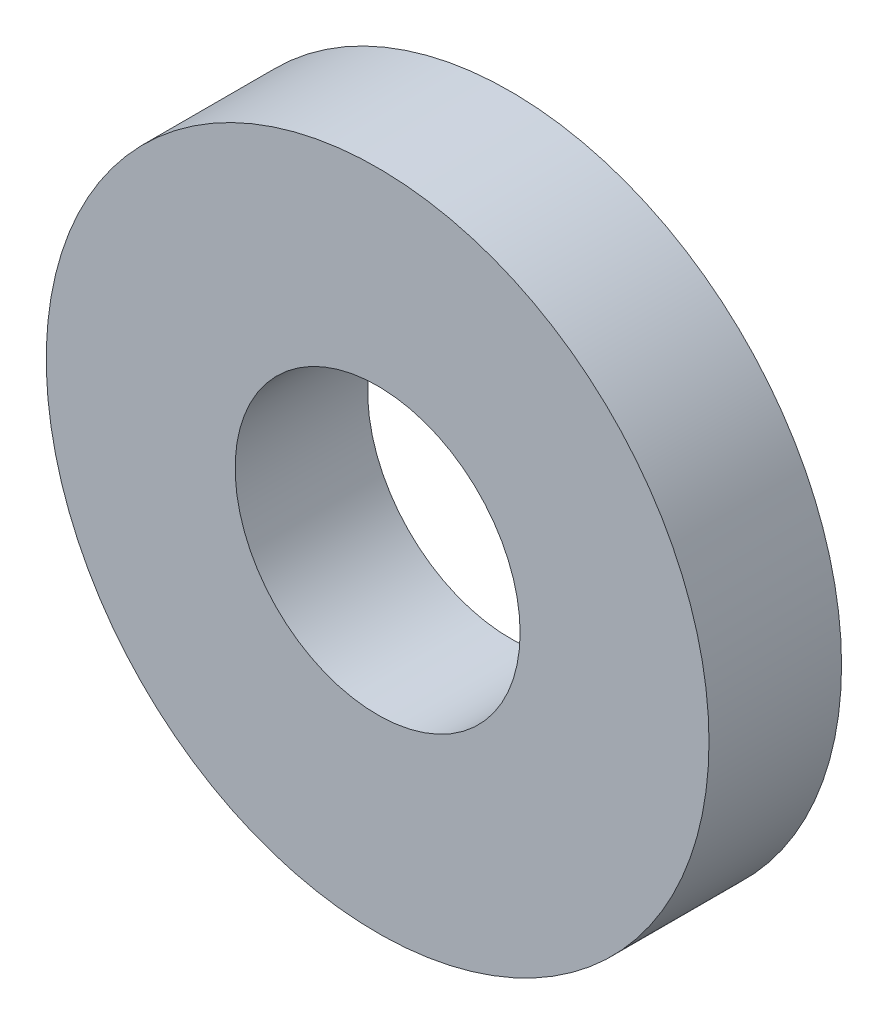
ISO-10303-21;
HEADER;
FILE_DESCRIPTION(('STEP AP214'),'2;1');
FILE_NAME('part.step','',(''),(''),'','','');
FILE_SCHEMA(('AUTOMOTIVE_DESIGN { 1 0 10303 214 1 1 1 1 }'));
ENDSEC;
DATA;
#1=APPLICATION_CONTEXT('core data for automotive mechanical design processes');
#2=APPLICATION_PROTOCOL_DEFINITION('international standard','automotive_design',2000,#1);
#3=PRODUCT_CONTEXT('',#1,'mechanical');
#4=PRODUCT('Part','Part','',(#3));
#5=PRODUCT_RELATED_PRODUCT_CATEGORY('part','',(#4));
#6=PRODUCT_DEFINITION_FORMATION('','',#4);
#7=PRODUCT_DEFINITION_CONTEXT('part definition',#1,'design');
#8=PRODUCT_DEFINITION('design','',#6,#7);
#9=PRODUCT_DEFINITION_SHAPE('','',#8);
#10=(LENGTH_UNIT() NAMED_UNIT(*) SI_UNIT(.MILLI.,.METRE.));
#11=(NAMED_UNIT(*) PLANE_ANGLE_UNIT() SI_UNIT($,.RADIAN.));
#12=(NAMED_UNIT(*) SI_UNIT($,.STERADIAN.) SOLID_ANGLE_UNIT());
#13=UNCERTAINTY_MEASURE_WITH_UNIT(LENGTH_MEASURE(1.E-05),#10,'distance_accuracy_value','');
#14=(GEOMETRIC_REPRESENTATION_CONTEXT(3) GLOBAL_UNCERTAINTY_ASSIGNED_CONTEXT((#13)) GLOBAL_UNIT_ASSIGNED_CONTEXT((#10,
#11,#12)) REPRESENTATION_CONTEXT('',''));
#15=CARTESIAN_POINT('',(0.,0.,0.));
#16=DIRECTION('',(0.,0.,1.));
#17=DIRECTION('',(1.,0.,0.));
#18=AXIS2_PLACEMENT_3D('',#15,#16,#17);
#19=CARTESIAN_POINT('',(0.,0.,2.));
#20=DIRECTION('',(0.,0.,1.));
#21=DIRECTION('',(1.,0.,0.));
#22=AXIS2_PLACEMENT_3D('',#19,#20,#21);
#23=PLANE('',#22);
#24=CARTESIAN_POINT('',(0.,0.,2.));
#25=DIRECTION('',(0.,0.,1.));
#26=DIRECTION('',(1.,0.,0.));
#27=AXIS2_PLACEMENT_3D('',#24,#25,#26);
#28=CIRCLE('',#27,5.);
#29=CARTESIAN_POINT('',(5.,0.,2.));
#30=VERTEX_POINT('',#29);
#31=EDGE_CURVE('E10',#30,#30,#28,.T.);
#32=ORIENTED_EDGE('',*,*,#31,.T.);
#33=EDGE_LOOP('',(#32));
#34=FACE_BOUND('',#33,.T.);
#35=CARTESIAN_POINT('',(0.,0.,2.));
#36=DIRECTION('',(0.,0.,1.));
#37=DIRECTION('',(1.,0.,0.));
#38=AXIS2_PLACEMENT_3D('',#35,#36,#37);
#39=CIRCLE('',#38,2.15);
#40=CARTESIAN_POINT('',(2.15,0.,2.));
#41=VERTEX_POINT('',#40);
#42=EDGE_CURVE('E49',#41,#41,#39,.T.);
#43=ORIENTED_EDGE('',*,*,#42,.F.);
#44=EDGE_LOOP('',(#43));
#45=FACE_BOUND('',#44,.T.);
#46=ADVANCED_FACE('F39',(#34,#45),#23,.T.);
#47=CARTESIAN_POINT('',(0.,0.,0.));
#48=DIRECTION('',(0.,0.,1.));
#49=DIRECTION('',(1.,0.,0.));
#50=AXIS2_PLACEMENT_3D('',#47,#48,#49);
#51=PLANE('',#50);
#52=CARTESIAN_POINT('',(0.,0.,0.));
#53=DIRECTION('',(0.,0.,1.));
#54=DIRECTION('',(1.,0.,0.));
#55=AXIS2_PLACEMENT_3D('',#52,#53,#54);
#56=CIRCLE('',#55,5.);
#57=CARTESIAN_POINT('',(5.,0.,0.));
#58=VERTEX_POINT('',#57);
#59=EDGE_CURVE('E43',#58,#58,#56,.T.);
#60=ORIENTED_EDGE('',*,*,#59,.F.);
#61=EDGE_LOOP('',(#60));
#62=FACE_BOUND('',#61,.T.);
#63=CARTESIAN_POINT('',(0.,0.,0.));
#64=DIRECTION('',(0.,0.,1.));
#65=DIRECTION('',(1.,0.,0.));
#66=AXIS2_PLACEMENT_3D('',#63,#64,#65);
#67=CIRCLE('',#66,2.15);
#68=CARTESIAN_POINT('',(2.15,0.,0.));
#69=VERTEX_POINT('',#68);
#70=EDGE_CURVE('E55',#69,#69,#67,.T.);
#71=ORIENTED_EDGE('',*,*,#70,.T.);
#72=EDGE_LOOP('',(#71));
#73=FACE_BOUND('',#72,.T.);
#74=ADVANCED_FACE('F62',(#62,#73),#51,.F.);
#75=CARTESIAN_POINT('',(0.,0.,2.));
#76=DIRECTION('',(0.,0.,-1.));
#77=DIRECTION('',(-1.,0.,0.));
#78=AXIS2_PLACEMENT_3D('',#75,#76,#77);
#79=CYLINDRICAL_SURFACE('',#78,5.);
#80=ORIENTED_EDGE('',*,*,#31,.F.);
#81=EDGE_LOOP('',(#80));
#82=FACE_BOUND('',#81,.T.);
#83=ORIENTED_EDGE('',*,*,#59,.T.);
#84=EDGE_LOOP('',(#83));
#85=FACE_BOUND('',#84,.T.);
#86=ADVANCED_FACE('F41',(#82,#85),#79,.T.);
#87=CARTESIAN_POINT('',(0.,0.,2.));
#88=DIRECTION('',(0.,0.,-1.));
#89=DIRECTION('',(-1.,0.,0.));
#90=AXIS2_PLACEMENT_3D('',#87,#88,#89);
#91=CYLINDRICAL_SURFACE('',#90,2.15);
#92=ORIENTED_EDGE('',*,*,#42,.T.);
#93=EDGE_LOOP('',(#92));
#94=FACE_BOUND('',#93,.T.);
#95=ORIENTED_EDGE('',*,*,#70,.F.);
#96=EDGE_LOOP('',(#95));
#97=FACE_BOUND('',#96,.T.);
#98=ADVANCED_FACE('F59',(#94,#97),#91,.F.);
#99=CLOSED_SHELL('',(#46,#74,#86,#98));
#100=MANIFOLD_SOLID_BREP('B2',#99);
#101=ADVANCED_BREP_SHAPE_REPRESENTATION('',(#18,#100),#14);
#102=SHAPE_DEFINITION_REPRESENTATION(#9,#101);
ENDSEC;
END-ISO-10303-21;
